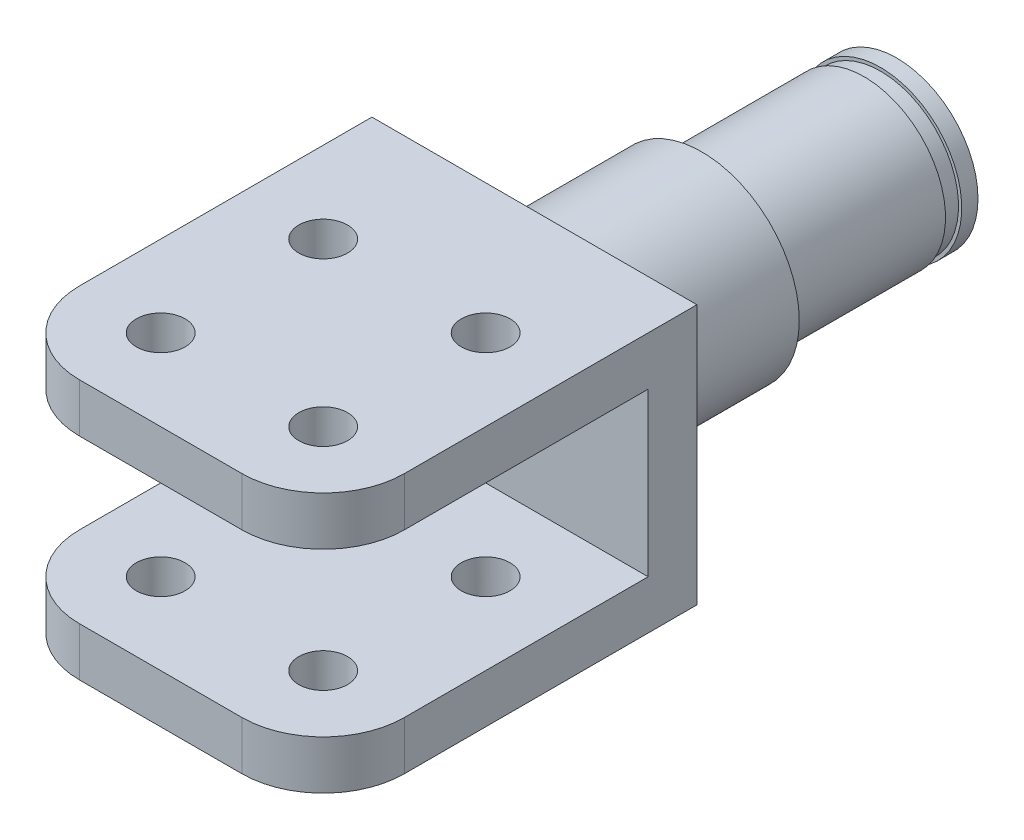
ISO-10303-21;
HEADER;
FILE_DESCRIPTION(('STEP AP214'),'2;1');
FILE_NAME('part.step','',(''),(''),'','','');
FILE_SCHEMA(('AUTOMOTIVE_DESIGN { 1 0 10303 214 1 1 1 1 }'));
ENDSEC;
DATA;
#1=APPLICATION_CONTEXT('core data for automotive mechanical design processes');
#2=APPLICATION_PROTOCOL_DEFINITION('international standard','automotive_design',2000,#1);
#3=PRODUCT_CONTEXT('',#1,'mechanical');
#4=PRODUCT('Part','Part','',(#3));
#5=PRODUCT_RELATED_PRODUCT_CATEGORY('part','',(#4));
#6=PRODUCT_DEFINITION_FORMATION('','',#4);
#7=PRODUCT_DEFINITION_CONTEXT('part definition',#1,'design');
#8=PRODUCT_DEFINITION('design','',#6,#7);
#9=PRODUCT_DEFINITION_SHAPE('','',#8);
#10=(LENGTH_UNIT() NAMED_UNIT(*) SI_UNIT(.MILLI.,.METRE.));
#11=(NAMED_UNIT(*) PLANE_ANGLE_UNIT() SI_UNIT($,.RADIAN.));
#12=(NAMED_UNIT(*) SI_UNIT($,.STERADIAN.) SOLID_ANGLE_UNIT());
#13=UNCERTAINTY_MEASURE_WITH_UNIT(LENGTH_MEASURE(1.E-05),#10,'distance_accuracy_value','');
#14=(GEOMETRIC_REPRESENTATION_CONTEXT(3) GLOBAL_UNCERTAINTY_ASSIGNED_CONTEXT((#13)) GLOBAL_UNIT_ASSIGNED_CONTEXT((#10,
#11,#12)) REPRESENTATION_CONTEXT('',''));
#15=CARTESIAN_POINT('',(0.,0.,0.));
#16=DIRECTION('',(0.,0.,1.));
#17=DIRECTION('',(1.,0.,0.));
#18=AXIS2_PLACEMENT_3D('',#15,#16,#17);
#19=CARTESIAN_POINT('',(0.,0.,45.3));
#20=DIRECTION('',(0.,0.,1.));
#21=DIRECTION('',(1.,0.,0.));
#22=AXIS2_PLACEMENT_3D('',#19,#20,#21);
#23=PLANE('',#22);
#24=DIRECTION('',(1.,0.,0.));
#25=VECTOR('',#24,1.);
#26=CARTESIAN_POINT('',(-10.,-5.,45.3));
#27=LINE('',#26,#25);
#28=CARTESIAN_POINT('',(-5.,-5.,45.3));
#29=VERTEX_POINT('',#28);
#30=CARTESIAN_POINT('',(5.,-5.,45.3));
#31=VERTEX_POINT('',#30);
#32=EDGE_CURVE('E144',#29,#31,#27,.T.);
#33=ORIENTED_EDGE('',*,*,#32,.F.);
#34=DIRECTION('',(0.,-1.,0.));
#35=VECTOR('',#34,1.);
#36=CARTESIAN_POINT('',(-5.,-8.,45.3));
#37=LINE('',#36,#35);
#38=CARTESIAN_POINT('',(-5.,-8.,45.3));
#39=VERTEX_POINT('',#38);
#40=EDGE_CURVE('E247',#29,#39,#37,.T.);
#41=ORIENTED_EDGE('',*,*,#40,.T.);
#42=DIRECTION('',(1.,0.,0.));
#43=VECTOR('',#42,1.);
#44=CARTESIAN_POINT('',(-10.,-8.,45.3));
#45=LINE('',#44,#43);
#46=CARTESIAN_POINT('',(5.,-8.,45.3));
#47=VERTEX_POINT('',#46);
#48=EDGE_CURVE('E158',#39,#47,#45,.T.);
#49=ORIENTED_EDGE('',*,*,#48,.T.);
#50=DIRECTION('',(0.,1.,0.));
#51=VECTOR('',#50,1.);
#52=CARTESIAN_POINT('',(5.,-5.,45.3));
#53=LINE('',#52,#51);
#54=EDGE_CURVE('E244',#47,#31,#53,.T.);
#55=ORIENTED_EDGE('',*,*,#54,.T.);
#56=EDGE_LOOP('',(#33,#41,#49,#55));
#57=FACE_BOUND('',#56,.T.);
#58=ADVANCED_FACE('F37',(#57),#23,.T.);
#59=CARTESIAN_POINT('',(0.,0.,12.));
#60=DIRECTION('',(0.,0.,-1.));
#61=DIRECTION('',(-1.,0.,0.));
#62=AXIS2_PLACEMENT_3D('',#59,#60,#61);
#63=CYLINDRICAL_SURFACE('',#62,5.);
#64=CARTESIAN_POINT('',(0.,0.,12.));
#65=DIRECTION('',(0.,0.,1.));
#66=DIRECTION('',(1.,0.,0.));
#67=AXIS2_PLACEMENT_3D('',#64,#65,#66);
#68=CIRCLE('',#67,5.);
#69=CARTESIAN_POINT('',(5.,0.,12.));
#70=VERTEX_POINT('',#69);
#71=EDGE_CURVE('E201',#70,#70,#68,.T.);
#72=ORIENTED_EDGE('',*,*,#71,.F.);
#73=EDGE_LOOP('',(#72));
#74=FACE_BOUND('',#73,.T.);
#75=CARTESIAN_POINT('',(0.,0.,2.));
#76=DIRECTION('',(0.,0.,-1.));
#77=DIRECTION('',(-1.,0.,0.));
#78=AXIS2_PLACEMENT_3D('',#75,#76,#77);
#79=CIRCLE('',#78,5.);
#80=CARTESIAN_POINT('',(-5.,0.,2.));
#81=VERTEX_POINT('',#80);
#82=EDGE_CURVE('E195',#81,#81,#79,.T.);
#83=ORIENTED_EDGE('',*,*,#82,.F.);
#84=EDGE_LOOP('',(#83));
#85=FACE_BOUND('',#84,.T.);
#86=ADVANCED_FACE('F296',(#74,#85),#63,.T.);
#87=CARTESIAN_POINT('',(0.,0.,2.));
#88=DIRECTION('',(0.,0.,-1.));
#89=DIRECTION('',(-1.,0.,0.));
#90=AXIS2_PLACEMENT_3D('',#87,#88,#89);
#91=PLANE('',#90);
#92=CARTESIAN_POINT('',(0.,0.,2.));
#93=DIRECTION('',(0.,0.,-1.));
#94=DIRECTION('',(-1.,0.,0.));
#95=AXIS2_PLACEMENT_3D('',#92,#93,#94);
#96=CIRCLE('',#95,4.8);
#97=CARTESIAN_POINT('',(-4.8,0.,2.));
#98=VERTEX_POINT('',#97);
#99=EDGE_CURVE('E189',#98,#98,#96,.T.);
#100=ORIENTED_EDGE('',*,*,#99,.F.);
#101=EDGE_LOOP('',(#100));
#102=FACE_BOUND('',#101,.T.);
#103=ORIENTED_EDGE('',*,*,#82,.T.);
#104=EDGE_LOOP('',(#103));
#105=FACE_BOUND('',#104,.T.);
#106=ADVANCED_FACE('F302',(#102,#105),#91,.T.);
#107=CARTESIAN_POINT('',(0.,0.,1.));
#108=DIRECTION('',(0.,0.,-1.));
#109=DIRECTION('',(-1.,0.,0.));
#110=AXIS2_PLACEMENT_3D('',#107,#108,#109);
#111=PLANE('',#110);
#112=CARTESIAN_POINT('',(0.,0.,1.));
#113=DIRECTION('',(0.,0.,-1.));
#114=DIRECTION('',(-1.,0.,0.));
#115=AXIS2_PLACEMENT_3D('',#112,#113,#114);
#116=CIRCLE('',#115,4.8);
#117=CARTESIAN_POINT('',(-4.8,0.,1.));
#118=VERTEX_POINT('',#117);
#119=EDGE_CURVE('E186',#118,#118,#116,.T.);
#120=ORIENTED_EDGE('',*,*,#119,.T.);
#121=EDGE_LOOP('',(#120));
#122=FACE_BOUND('',#121,.T.);
#123=CARTESIAN_POINT('',(0.,0.,1.));
#124=DIRECTION('',(0.,0.,-1.));
#125=DIRECTION('',(-1.,0.,0.));
#126=AXIS2_PLACEMENT_3D('',#123,#124,#125);
#127=CIRCLE('',#126,5.);
#128=CARTESIAN_POINT('',(-5.,0.,1.));
#129=VERTEX_POINT('',#128);
#130=EDGE_CURVE('E192',#129,#129,#127,.T.);
#131=ORIENTED_EDGE('',*,*,#130,.F.);
#132=EDGE_LOOP('',(#131));
#133=FACE_BOUND('',#132,.T.);
#134=ADVANCED_FACE('F597',(#122,#133),#111,.F.);
#135=CARTESIAN_POINT('',(0.,0.,2.));
#136=DIRECTION('',(0.,0.,-1.));
#137=DIRECTION('',(-1.,0.,0.));
#138=AXIS2_PLACEMENT_3D('',#135,#136,#137);
#139=CYLINDRICAL_SURFACE('',#138,4.8);
#140=ORIENTED_EDGE('',*,*,#99,.T.);
#141=EDGE_LOOP('',(#140));
#142=FACE_BOUND('',#141,.T.);
#143=ORIENTED_EDGE('',*,*,#119,.F.);
#144=EDGE_LOOP('',(#143));
#145=FACE_BOUND('',#144,.T.);
#146=ADVANCED_FACE('F446',(#142,#145),#139,.T.);
#147=CARTESIAN_POINT('',(0.,0.,0.));
#148=DIRECTION('',(0.,0.,1.));
#149=DIRECTION('',(1.,0.,0.));
#150=AXIS2_PLACEMENT_3D('',#147,#148,#149);
#151=PLANE('',#150);
#152=CARTESIAN_POINT('',(0.,0.,0.));
#153=DIRECTION('',(0.,0.,-1.));
#154=DIRECTION('',(-1.,0.,0.));
#155=AXIS2_PLACEMENT_3D('',#152,#153,#154);
#156=CIRCLE('',#155,2.);
#157=CARTESIAN_POINT('',(-2.,0.,0.));
#158=VERTEX_POINT('',#157);
#159=EDGE_CURVE('E358',#158,#158,#156,.T.);
#160=ORIENTED_EDGE('',*,*,#159,.F.);
#161=EDGE_LOOP('',(#160));
#162=FACE_BOUND('',#161,.T.);
#163=CARTESIAN_POINT('',(0.,0.,0.));
#164=DIRECTION('',(0.,0.,1.));
#165=DIRECTION('',(1.,0.,0.));
#166=AXIS2_PLACEMENT_3D('',#163,#164,#165);
#167=CIRCLE('',#166,5.);
#168=CARTESIAN_POINT('',(5.,0.,0.));
#169=VERTEX_POINT('',#168);
#170=EDGE_CURVE('E198',#169,#169,#167,.T.);
#171=ORIENTED_EDGE('',*,*,#170,.F.);
#172=EDGE_LOOP('',(#171));
#173=FACE_BOUND('',#172,.T.);
#174=ADVANCED_FACE('F442',(#162,#173),#151,.F.);
#175=ORIENTED_EDGE('',*,*,#130,.T.);
#176=EDGE_LOOP('',(#175));
#177=FACE_BOUND('',#176,.T.);
#178=ORIENTED_EDGE('',*,*,#170,.T.);
#179=EDGE_LOOP('',(#178));
#180=FACE_BOUND('',#179,.T.);
#181=ADVANCED_FACE('F305',(#177,#180),#63,.T.);
#182=CARTESIAN_POINT('',(0.,0.,22.3));
#183=DIRECTION('',(0.,0.,-1.));
#184=DIRECTION('',(-1.,0.,0.));
#185=AXIS2_PLACEMENT_3D('',#182,#183,#184);
#186=CYLINDRICAL_SURFACE('',#185,6.);
#187=CARTESIAN_POINT('',(0.,0.,22.3));
#188=DIRECTION('',(0.,0.,1.));
#189=DIRECTION('',(1.,0.,0.));
#190=AXIS2_PLACEMENT_3D('',#187,#188,#189);
#191=CIRCLE('',#190,6.);
#192=CARTESIAN_POINT('',(-6.,0.,22.3));
#193=VERTEX_POINT('',#192);
#194=EDGE_CURVE('E183',#193,#193,#191,.T.);
#195=CARTESIAN_POINT('',(0.,0.,12.));
#196=DIRECTION('',(0.,0.,1.));
#197=DIRECTION('',(1.,0.,0.));
#198=AXIS2_PLACEMENT_3D('',#195,#196,#197);
#199=CIRCLE('',#198,6.);
#200=CARTESIAN_POINT('',(-6.,0.,12.));
#201=VERTEX_POINT('',#200);
#202=EDGE_CURVE('E182',#201,#201,#199,.T.);
#203=CARTESIAN_POINT('',(-6.,0.,22.3));
#204=CARTESIAN_POINT('',(-6.,0.,22.1927083333333));
#205=CARTESIAN_POINT('',(-6.,0.,22.0854166666667));
#206=CARTESIAN_POINT('',(-6.,0.,21.8708333333333));
#207=CARTESIAN_POINT('',(-6.,0.,21.7635416666667));
#208=CARTESIAN_POINT('',(-6.,0.,21.5489583333333));
#209=CARTESIAN_POINT('',(-6.,0.,21.4416666666667));
#210=CARTESIAN_POINT('',(-6.,0.,21.2270833333333));
#211=CARTESIAN_POINT('',(-6.,0.,21.1197916666667));
#212=CARTESIAN_POINT('',(-6.,0.,20.9052083333333));
#213=CARTESIAN_POINT('',(-6.,0.,20.7979166666667));
#214=CARTESIAN_POINT('',(-6.,0.,20.5833333333333));
#215=CARTESIAN_POINT('',(-6.,0.,20.4760416666667));
#216=CARTESIAN_POINT('',(-6.,0.,20.2614583333333));
#217=CARTESIAN_POINT('',(-6.,0.,20.1541666666667));
#218=CARTESIAN_POINT('',(-6.,0.,19.9395833333333));
#219=CARTESIAN_POINT('',(-6.,0.,19.8322916666667));
#220=CARTESIAN_POINT('',(-6.,0.,19.6177083333333));
#221=CARTESIAN_POINT('',(-6.,0.,19.5104166666667));
#222=CARTESIAN_POINT('',(-6.,0.,19.2958333333333));
#223=CARTESIAN_POINT('',(-6.,0.,19.1885416666667));
#224=CARTESIAN_POINT('',(-6.,0.,18.9739583333333));
#225=CARTESIAN_POINT('',(-6.,0.,18.8666666666667));
#226=CARTESIAN_POINT('',(-6.,0.,18.6520833333333));
#227=CARTESIAN_POINT('',(-6.,0.,18.5447916666667));
#228=CARTESIAN_POINT('',(-6.,0.,18.3302083333333));
#229=CARTESIAN_POINT('',(-6.,0.,18.2229166666667));
#230=CARTESIAN_POINT('',(-6.,0.,18.0083333333333));
#231=CARTESIAN_POINT('',(-6.,0.,17.9010416666667));
#232=CARTESIAN_POINT('',(-6.,0.,17.6864583333333));
#233=CARTESIAN_POINT('',(-6.,0.,17.5791666666667));
#234=CARTESIAN_POINT('',(-6.,0.,17.3645833333333));
#235=CARTESIAN_POINT('',(-6.,0.,17.2572916666667));
#236=CARTESIAN_POINT('',(-6.,0.,17.0427083333333));
#237=CARTESIAN_POINT('',(-6.,0.,16.9354166666667));
#238=CARTESIAN_POINT('',(-6.,0.,16.7208333333333));
#239=CARTESIAN_POINT('',(-6.,0.,16.6135416666667));
#240=CARTESIAN_POINT('',(-6.,0.,16.3989583333333));
#241=CARTESIAN_POINT('',(-6.,0.,16.2916666666667));
#242=CARTESIAN_POINT('',(-6.,0.,16.0770833333333));
#243=CARTESIAN_POINT('',(-6.,0.,15.9697916666667));
#244=CARTESIAN_POINT('',(-6.,0.,15.7552083333333));
#245=CARTESIAN_POINT('',(-6.,0.,15.6479166666667));
#246=CARTESIAN_POINT('',(-6.,0.,15.4333333333333));
#247=CARTESIAN_POINT('',(-6.,0.,15.3260416666667));
#248=CARTESIAN_POINT('',(-6.,0.,15.1114583333333));
#249=CARTESIAN_POINT('',(-6.,0.,15.0041666666667));
#250=CARTESIAN_POINT('',(-6.,0.,14.7895833333333));
#251=CARTESIAN_POINT('',(-6.,0.,14.6822916666667));
#252=CARTESIAN_POINT('',(-6.,0.,14.4677083333333));
#253=CARTESIAN_POINT('',(-6.,0.,14.3604166666667));
#254=CARTESIAN_POINT('',(-6.,0.,14.1458333333333));
#255=CARTESIAN_POINT('',(-6.,0.,14.0385416666667));
#256=CARTESIAN_POINT('',(-6.,0.,13.8239583333333));
#257=CARTESIAN_POINT('',(-6.,0.,13.7166666666667));
#258=CARTESIAN_POINT('',(-6.,0.,13.5020833333333));
#259=CARTESIAN_POINT('',(-6.,0.,13.3947916666667));
#260=CARTESIAN_POINT('',(-6.,0.,13.1802083333333));
#261=CARTESIAN_POINT('',(-6.,0.,13.0729166666667));
#262=CARTESIAN_POINT('',(-6.,0.,12.8583333333333));
#263=CARTESIAN_POINT('',(-6.,0.,12.7510416666667));
#264=CARTESIAN_POINT('',(-6.,0.,12.5364583333333));
#265=CARTESIAN_POINT('',(-6.,0.,12.4291666666667));
#266=CARTESIAN_POINT('',(-6.,0.,12.2145833333333));
#267=CARTESIAN_POINT('',(-6.,0.,12.1072916666667));
#268=CARTESIAN_POINT('',(-6.,0.,12.));
#269=B_SPLINE_CURVE_WITH_KNOTS('',3,(#203,#204,#205,#206,#207,#208,#209,#210,#211,#212,#213,
#214,#215,#216,#217,#218,#219,#220,#221,#222,#223,#224,#225,#226,#227,#228,#229,#230,#231,#232,
#233,#234,#235,#236,#237,#238,#239,#240,#241,#242,#243,#244,#245,#246,#247,#248,#249,#250,#251,
#252,#253,#254,#255,#256,#257,#258,#259,#260,#261,#262,#263,#264,#265,#266,#267,#268),
.UNSPECIFIED.,.F.,.F.,(4,2,2,2,2,2,2,2,2,2,2,2,2,2,2,2,2,2,2,2,2,2,2,2,2,2,2,2,2,2,2,2,4),(0.,
0.321875000000003,0.643750000000002,0.965625000000001,1.2875,1.609375,1.93125,2.253125,2.575,
2.896875,3.21875,3.540625,3.8625,4.184375,4.50625,4.828125,5.15,5.471875,5.79375,6.115625,
6.4375,6.759375,7.08125,7.403125,7.725,8.046875,8.36875,8.690625,9.0125,9.334375,9.65625,
9.978125,10.3),.UNSPECIFIED.);
#270=EDGE_CURVE('BSEAM573',#193,#201,#269,.T.);
#271=ORIENTED_EDGE('',*,*,#194,.F.);
#272=ORIENTED_EDGE('',*,*,#202,.T.);
#273=ORIENTED_EDGE('',*,*,#270,.T.);
#274=ORIENTED_EDGE('',*,*,#270,.F.);
#275=EDGE_LOOP('',(#271,#273,#272,#274));
#276=FACE_BOUND('',#275,.T.);
#277=ADVANCED_FACE('F573',(#276),#186,.T.);
#278=CARTESIAN_POINT('',(0.,0.,12.));
#279=DIRECTION('',(0.,0.,1.));
#280=DIRECTION('',(1.,0.,0.));
#281=AXIS2_PLACEMENT_3D('',#278,#279,#280);
#282=PLANE('',#281);
#283=ORIENTED_EDGE('',*,*,#71,.T.);
#284=EDGE_LOOP('',(#283));
#285=FACE_BOUND('',#284,.T.);
#286=ORIENTED_EDGE('',*,*,#202,.F.);
#287=EDGE_LOOP('',(#286));
#288=FACE_BOUND('',#287,.T.);
#289=ADVANCED_FACE('F556',(#285,#288),#282,.F.);
#290=CARTESIAN_POINT('',(10.,8.,45.3));
#291=DIRECTION('',(-1.,0.,0.));
#292=DIRECTION('',(0.,-1.,0.));
#293=AXIS2_PLACEMENT_3D('',#290,#291,#292);
#294=PLANE('',#293);
#295=DIRECTION('',(0.,0.,1.));
#296=VECTOR('',#295,1.);
#297=CARTESIAN_POINT('',(9.99999999999999,-5.,25.3));
#298=LINE('',#297,#296);
#299=CARTESIAN_POINT('',(9.99999999999999,-5.,25.3));
#300=VERTEX_POINT('',#299);
#301=CARTESIAN_POINT('',(9.99999999999999,-5.,40.3));
#302=VERTEX_POINT('',#301);
#303=EDGE_CURVE('E167',#300,#302,#298,.T.);
#304=ORIENTED_EDGE('',*,*,#303,.T.);
#305=DIRECTION('',(0.,1.,0.));
#306=VECTOR('',#305,1.);
#307=CARTESIAN_POINT('',(10.,-8.,40.3));
#308=LINE('',#307,#306);
#309=CARTESIAN_POINT('',(10.,-8.,40.3));
#310=VERTEX_POINT('',#309);
#311=EDGE_CURVE('E11',#302,#310,#308,.F.);
#312=ORIENTED_EDGE('',*,*,#311,.T.);
#313=DIRECTION('',(0.,0.,-1.));
#314=VECTOR('',#313,1.);
#315=CARTESIAN_POINT('',(10.,-8.,45.3));
#316=LINE('',#315,#314);
#317=CARTESIAN_POINT('',(10.,-8.,22.3));
#318=VERTEX_POINT('',#317);
#319=EDGE_CURVE('E162',#310,#318,#316,.T.);
#320=ORIENTED_EDGE('',*,*,#319,.T.);
#321=DIRECTION('',(0.,1.,0.));
#322=VECTOR('',#321,1.);
#323=CARTESIAN_POINT('',(10.,8.,22.3));
#324=LINE('',#323,#322);
#325=CARTESIAN_POINT('',(10.,8.,22.3));
#326=VERTEX_POINT('',#325);
#327=EDGE_CURVE('E163',#318,#326,#324,.T.);
#328=ORIENTED_EDGE('',*,*,#327,.T.);
#329=DIRECTION('',(0.,0.,-1.));
#330=VECTOR('',#329,1.);
#331=CARTESIAN_POINT('',(10.,8.,45.3));
#332=LINE('',#331,#330);
#333=CARTESIAN_POINT('',(10.,8.,40.3));
#334=VERTEX_POINT('',#333);
#335=EDGE_CURVE('E180',#334,#326,#332,.T.);
#336=ORIENTED_EDGE('',*,*,#335,.F.);
#337=DIRECTION('',(0.,1.,0.));
#338=VECTOR('',#337,1.);
#339=CARTESIAN_POINT('',(10.,5.,40.3));
#340=LINE('',#339,#338);
#341=CARTESIAN_POINT('',(9.99999999999999,5.,40.3));
#342=VERTEX_POINT('',#341);
#343=EDGE_CURVE('E46',#334,#342,#340,.F.);
#344=ORIENTED_EDGE('',*,*,#343,.T.);
#345=DIRECTION('',(0.,0.,1.));
#346=VECTOR('',#345,1.);
#347=CARTESIAN_POINT('',(9.99999999999999,5.,25.3));
#348=LINE('',#347,#346);
#349=CARTESIAN_POINT('',(9.99999999999999,5.,25.3));
#350=VERTEX_POINT('',#349);
#351=EDGE_CURVE('E130',#350,#342,#348,.T.);
#352=ORIENTED_EDGE('',*,*,#351,.F.);
#353=DIRECTION('',(0.,1.,0.));
#354=VECTOR('',#353,1.);
#355=CARTESIAN_POINT('',(9.99999999999999,5.,25.3));
#356=LINE('',#355,#354);
#357=EDGE_CURVE('E137',#300,#350,#356,.T.);
#358=ORIENTED_EDGE('',*,*,#357,.F.);
#359=EDGE_LOOP('',(#304,#312,#320,#328,#336,#344,#352,#358));
#360=FACE_BOUND('',#359,.T.);
#361=ADVANCED_FACE('F146',(#360),#294,.F.);
#362=CARTESIAN_POINT('',(-10.,8.,45.3));
#363=DIRECTION('',(0.,-1.,0.));
#364=DIRECTION('',(0.,0.,-1.));
#365=AXIS2_PLACEMENT_3D('',#362,#363,#364);
#366=PLANE('',#365);
#367=CARTESIAN_POINT('',(5.,8.,30.3));
#368=DIRECTION('',(0.,1.,0.));
#369=DIRECTION('',(0.,0.,1.));
#370=AXIS2_PLACEMENT_3D('',#367,#368,#369);
#371=CIRCLE('',#370,1.5);
#372=CARTESIAN_POINT('',(5.,8.,31.8));
#373=VERTEX_POINT('',#372);
#374=EDGE_CURVE('E350',#373,#373,#371,.T.);
#375=ORIENTED_EDGE('',*,*,#374,.F.);
#376=EDGE_LOOP('',(#375));
#377=FACE_BOUND('',#376,.T.);
#378=CARTESIAN_POINT('',(-5.,8.,30.3));
#379=DIRECTION('',(0.,1.,0.));
#380=DIRECTION('',(0.,0.,1.));
#381=AXIS2_PLACEMENT_3D('',#378,#379,#380);
#382=CIRCLE('',#381,1.5);
#383=CARTESIAN_POINT('',(-5.,8.,31.8));
#384=VERTEX_POINT('',#383);
#385=EDGE_CURVE('E353',#384,#384,#382,.T.);
#386=ORIENTED_EDGE('',*,*,#385,.F.);
#387=EDGE_LOOP('',(#386));
#388=FACE_BOUND('',#387,.T.);
#389=CARTESIAN_POINT('',(-5.,8.,40.3));
#390=DIRECTION('',(0.,1.,0.));
#391=DIRECTION('',(0.,0.,1.));
#392=AXIS2_PLACEMENT_3D('',#389,#390,#391);
#393=CIRCLE('',#392,1.5);
#394=CARTESIAN_POINT('',(-5.,8.,41.8));
#395=VERTEX_POINT('',#394);
#396=EDGE_CURVE('E349',#395,#395,#393,.T.);
#397=ORIENTED_EDGE('',*,*,#396,.F.);
#398=EDGE_LOOP('',(#397));
#399=FACE_BOUND('',#398,.T.);
#400=CARTESIAN_POINT('',(5.,8.,40.3));
#401=DIRECTION('',(0.,1.,0.));
#402=DIRECTION('',(0.,0.,1.));
#403=AXIS2_PLACEMENT_3D('',#400,#401,#402);
#404=CIRCLE('',#403,1.5);
#405=CARTESIAN_POINT('',(5.,8.,41.8));
#406=VERTEX_POINT('',#405);
#407=EDGE_CURVE('E211',#406,#406,#404,.T.);
#408=ORIENTED_EDGE('',*,*,#407,.F.);
#409=EDGE_LOOP('',(#408));
#410=FACE_BOUND('',#409,.T.);
#411=DIRECTION('',(0.,0.,-1.));
#412=VECTOR('',#411,1.);
#413=CARTESIAN_POINT('',(-10.,8.,45.3));
#414=LINE('',#413,#412);
#415=CARTESIAN_POINT('',(-10.,8.,40.3));
#416=VERTEX_POINT('',#415);
#417=CARTESIAN_POINT('',(-10.,8.,22.3));
#418=VERTEX_POINT('',#417);
#419=EDGE_CURVE('E178',#416,#418,#414,.T.);
#420=ORIENTED_EDGE('',*,*,#419,.F.);
#421=CARTESIAN_POINT('',(-5.,8.,40.3));
#422=DIRECTION('',(0.,-1.,0.));
#423=DIRECTION('',(0.,0.,-1.));
#424=AXIS2_PLACEMENT_3D('',#421,#422,#423);
#425=CIRCLE('',#424,5.);
#426=CARTESIAN_POINT('',(-5.,8.,45.3));
#427=VERTEX_POINT('',#426);
#428=EDGE_CURVE('E242',#416,#427,#425,.F.);
#429=ORIENTED_EDGE('',*,*,#428,.T.);
#430=DIRECTION('',(-1.,0.,0.));
#431=VECTOR('',#430,1.);
#432=CARTESIAN_POINT('',(-10.,8.,45.3));
#433=LINE('',#432,#431);
#434=CARTESIAN_POINT('',(5.,8.,45.3));
#435=VERTEX_POINT('',#434);
#436=EDGE_CURVE('E155',#435,#427,#433,.T.);
#437=ORIENTED_EDGE('',*,*,#436,.F.);
#438=CARTESIAN_POINT('',(5.,8.,40.3));
#439=DIRECTION('',(0.,-1.,0.));
#440=DIRECTION('',(0.,0.,-1.));
#441=AXIS2_PLACEMENT_3D('',#438,#439,#440);
#442=CIRCLE('',#441,5.);
#443=EDGE_CURVE('E240',#435,#334,#442,.F.);
#444=ORIENTED_EDGE('',*,*,#443,.T.);
#445=ORIENTED_EDGE('',*,*,#335,.T.);
#446=DIRECTION('',(-1.,0.,0.));
#447=VECTOR('',#446,1.);
#448=CARTESIAN_POINT('',(-10.,8.,22.3));
#449=LINE('',#448,#447);
#450=EDGE_CURVE('E166',#326,#418,#449,.T.);
#451=ORIENTED_EDGE('',*,*,#450,.T.);
#452=EDGE_LOOP('',(#420,#429,#437,#444,#445,#451));
#453=FACE_BOUND('',#452,.T.);
#454=ADVANCED_FACE('F539',(#377,#388,#399,#410,#453),#366,.F.);
#455=CARTESIAN_POINT('',(-10.,8.,45.3));
#456=DIRECTION('',(1.,0.,0.));
#457=DIRECTION('',(0.,0.,-1.));
#458=AXIS2_PLACEMENT_3D('',#455,#456,#457);
#459=PLANE('',#458);
#460=DIRECTION('',(0.,0.,1.));
#461=VECTOR('',#460,1.);
#462=CARTESIAN_POINT('',(-10.,5.,25.3));
#463=LINE('',#462,#461);
#464=CARTESIAN_POINT('',(-10.,5.,25.3));
#465=VERTEX_POINT('',#464);
#466=CARTESIAN_POINT('',(-10.,5.,40.3));
#467=VERTEX_POINT('',#466);
#468=EDGE_CURVE('E133',#465,#467,#463,.T.);
#469=ORIENTED_EDGE('',*,*,#468,.T.);
#470=DIRECTION('',(0.,-1.,0.));
#471=VECTOR('',#470,1.);
#472=CARTESIAN_POINT('',(-10.,8.,40.3));
#473=LINE('',#472,#471);
#474=EDGE_CURVE('E238',#467,#416,#473,.F.);
#475=ORIENTED_EDGE('',*,*,#474,.T.);
#476=ORIENTED_EDGE('',*,*,#419,.T.);
#477=DIRECTION('',(0.,-1.,0.));
#478=VECTOR('',#477,1.);
#479=CARTESIAN_POINT('',(-10.,8.,22.3));
#480=LINE('',#479,#478);
#481=CARTESIAN_POINT('',(-10.,-8.,22.3));
#482=VERTEX_POINT('',#481);
#483=EDGE_CURVE('E170',#418,#482,#480,.T.);
#484=ORIENTED_EDGE('',*,*,#483,.T.);
#485=DIRECTION('',(0.,0.,-1.));
#486=VECTOR('',#485,1.);
#487=CARTESIAN_POINT('',(-10.,-8.,45.3));
#488=LINE('',#487,#486);
#489=CARTESIAN_POINT('',(-10.,-8.,40.3));
#490=VERTEX_POINT('',#489);
#491=EDGE_CURVE('E176',#490,#482,#488,.T.);
#492=ORIENTED_EDGE('',*,*,#491,.F.);
#493=DIRECTION('',(0.,-1.,0.));
#494=VECTOR('',#493,1.);
#495=CARTESIAN_POINT('',(-10.,-5.,40.3));
#496=LINE('',#495,#494);
#497=CARTESIAN_POINT('',(-10.,-5.,40.3));
#498=VERTEX_POINT('',#497);
#499=EDGE_CURVE('E236',#490,#498,#496,.F.);
#500=ORIENTED_EDGE('',*,*,#499,.T.);
#501=DIRECTION('',(0.,0.,1.));
#502=VECTOR('',#501,1.);
#503=CARTESIAN_POINT('',(-10.,-5.,25.3));
#504=LINE('',#503,#502);
#505=CARTESIAN_POINT('',(-10.,-5.,25.3));
#506=VERTEX_POINT('',#505);
#507=EDGE_CURVE('E150',#506,#498,#504,.T.);
#508=ORIENTED_EDGE('',*,*,#507,.F.);
#509=DIRECTION('',(0.,-1.,0.));
#510=VECTOR('',#509,1.);
#511=CARTESIAN_POINT('',(-10.,5.,25.3));
#512=LINE('',#511,#510);
#513=EDGE_CURVE('E136',#465,#506,#512,.T.);
#514=ORIENTED_EDGE('',*,*,#513,.F.);
#515=EDGE_LOOP('',(#469,#475,#476,#484,#492,#500,#508,#514));
#516=FACE_BOUND('',#515,.T.);
#517=ADVANCED_FACE('F275',(#516),#459,.F.);
#518=CARTESIAN_POINT('',(-10.,-8.,45.3));
#519=DIRECTION('',(0.,1.,0.));
#520=DIRECTION('',(0.,0.,1.));
#521=AXIS2_PLACEMENT_3D('',#518,#519,#520);
#522=PLANE('',#521);
#523=CARTESIAN_POINT('',(5.,-8.,30.3));
#524=DIRECTION('',(0.,1.,0.));
#525=DIRECTION('',(0.,0.,1.));
#526=AXIS2_PLACEMENT_3D('',#523,#524,#525);
#527=CIRCLE('',#526,1.5);
#528=CARTESIAN_POINT('',(5.,-8.,31.8));
#529=VERTEX_POINT('',#528);
#530=EDGE_CURVE('E327',#529,#529,#527,.T.);
#531=ORIENTED_EDGE('',*,*,#530,.T.);
#532=EDGE_LOOP('',(#531));
#533=FACE_BOUND('',#532,.T.);
#534=CARTESIAN_POINT('',(-5.,-8.,30.3));
#535=DIRECTION('',(0.,1.,0.));
#536=DIRECTION('',(0.,0.,1.));
#537=AXIS2_PLACEMENT_3D('',#534,#535,#536);
#538=CIRCLE('',#537,1.5);
#539=CARTESIAN_POINT('',(-5.,-8.,31.8));
#540=VERTEX_POINT('',#539);
#541=EDGE_CURVE('E226',#540,#540,#538,.T.);
#542=ORIENTED_EDGE('',*,*,#541,.T.);
#543=EDGE_LOOP('',(#542));
#544=FACE_BOUND('',#543,.T.);
#545=CARTESIAN_POINT('',(-5.,-8.,40.3));
#546=DIRECTION('',(0.,1.,0.));
#547=DIRECTION('',(0.,0.,1.));
#548=AXIS2_PLACEMENT_3D('',#545,#546,#547);
#549=CIRCLE('',#548,1.5);
#550=CARTESIAN_POINT('',(-5.,-8.,41.8));
#551=VERTEX_POINT('',#550);
#552=EDGE_CURVE('E221',#551,#551,#549,.T.);
#553=ORIENTED_EDGE('',*,*,#552,.T.);
#554=EDGE_LOOP('',(#553));
#555=FACE_BOUND('',#554,.T.);
#556=CARTESIAN_POINT('',(5.,-8.,40.3));
#557=DIRECTION('',(0.,1.,0.));
#558=DIRECTION('',(0.,0.,1.));
#559=AXIS2_PLACEMENT_3D('',#556,#557,#558);
#560=CIRCLE('',#559,1.5);
#561=CARTESIAN_POINT('',(5.,-8.,41.8));
#562=VERTEX_POINT('',#561);
#563=EDGE_CURVE('E216',#562,#562,#560,.T.);
#564=ORIENTED_EDGE('',*,*,#563,.T.);
#565=EDGE_LOOP('',(#564));
#566=FACE_BOUND('',#565,.T.);
#567=ORIENTED_EDGE('',*,*,#48,.F.);
#568=CARTESIAN_POINT('',(-5.,-8.,40.3));
#569=DIRECTION('',(0.,1.,0.));
#570=DIRECTION('',(0.,0.,1.));
#571=AXIS2_PLACEMENT_3D('',#568,#569,#570);
#572=CIRCLE('',#571,5.);
#573=EDGE_CURVE('E252',#39,#490,#572,.F.);
#574=ORIENTED_EDGE('',*,*,#573,.T.);
#575=ORIENTED_EDGE('',*,*,#491,.T.);
#576=DIRECTION('',(1.,0.,0.));
#577=VECTOR('',#576,1.);
#578=CARTESIAN_POINT('',(-10.,-8.,22.3));
#579=LINE('',#578,#577);
#580=EDGE_CURVE('E159',#482,#318,#579,.T.);
#581=ORIENTED_EDGE('',*,*,#580,.T.);
#582=ORIENTED_EDGE('',*,*,#319,.F.);
#583=CARTESIAN_POINT('',(5.,-8.,40.3));
#584=DIRECTION('',(0.,1.,0.));
#585=DIRECTION('',(0.,0.,1.));
#586=AXIS2_PLACEMENT_3D('',#583,#584,#585);
#587=CIRCLE('',#586,5.);
#588=EDGE_CURVE('E250',#310,#47,#587,.F.);
#589=ORIENTED_EDGE('',*,*,#588,.T.);
#590=EDGE_LOOP('',(#567,#574,#575,#581,#582,#589));
#591=FACE_BOUND('',#590,.T.);
#592=ADVANCED_FACE('F273',(#533,#544,#555,#566,#591),#522,.F.);
#593=ORIENTED_EDGE('',*,*,#436,.T.);
#594=DIRECTION('',(0.,-1.,0.));
#595=VECTOR('',#594,1.);
#596=CARTESIAN_POINT('',(-5.,5.,45.3));
#597=LINE('',#596,#595);
#598=CARTESIAN_POINT('',(-5.,5.,45.3));
#599=VERTEX_POINT('',#598);
#600=EDGE_CURVE('E229',#427,#599,#597,.T.);
#601=ORIENTED_EDGE('',*,*,#600,.T.);
#602=DIRECTION('',(-1.,0.,0.));
#603=VECTOR('',#602,1.);
#604=CARTESIAN_POINT('',(-10.,5.,45.3));
#605=LINE('',#604,#603);
#606=CARTESIAN_POINT('',(5.,5.,45.3));
#607=VERTEX_POINT('',#606);
#608=EDGE_CURVE('E268',#607,#599,#605,.T.);
#609=ORIENTED_EDGE('',*,*,#608,.F.);
#610=DIRECTION('',(0.,1.,0.));
#611=VECTOR('',#610,1.);
#612=CARTESIAN_POINT('',(5.,8.,45.3));
#613=LINE('',#612,#611);
#614=EDGE_CURVE('E204',#607,#435,#613,.T.);
#615=ORIENTED_EDGE('',*,*,#614,.T.);
#616=EDGE_LOOP('',(#593,#601,#609,#615));
#617=FACE_BOUND('',#616,.T.);
#618=ADVANCED_FACE('F298',(#617),#23,.T.);
#619=CARTESIAN_POINT('',(0.,0.,22.3));
#620=DIRECTION('',(0.,0.,1.));
#621=DIRECTION('',(1.,0.,0.));
#622=AXIS2_PLACEMENT_3D('',#619,#620,#621);
#623=PLANE('',#622);
#624=ORIENTED_EDGE('',*,*,#194,.T.);
#625=EDGE_LOOP('',(#624));
#626=FACE_BOUND('',#625,.T.);
#627=ORIENTED_EDGE('',*,*,#327,.F.);
#628=ORIENTED_EDGE('',*,*,#580,.F.);
#629=ORIENTED_EDGE('',*,*,#483,.F.);
#630=ORIENTED_EDGE('',*,*,#450,.F.);
#631=EDGE_LOOP('',(#627,#628,#629,#630));
#632=FACE_BOUND('',#631,.T.);
#633=ADVANCED_FACE('F282',(#626,#632),#623,.F.);
#634=CARTESIAN_POINT('',(-10.,-5.,25.3));
#635=DIRECTION('',(0.,-1.,0.));
#636=DIRECTION('',(0.,0.,-1.));
#637=AXIS2_PLACEMENT_3D('',#634,#635,#636);
#638=PLANE('',#637);
#639=CARTESIAN_POINT('',(5.,-5.,30.3));
#640=DIRECTION('',(0.,-1.,0.));
#641=DIRECTION('',(0.,0.,-1.));
#642=AXIS2_PLACEMENT_3D('',#639,#640,#641);
#643=CIRCLE('',#642,1.5);
#644=CARTESIAN_POINT('',(5.,-5.,28.8));
#645=VERTEX_POINT('',#644);
#646=EDGE_CURVE('E225',#645,#645,#643,.T.);
#647=ORIENTED_EDGE('',*,*,#646,.T.);
#648=EDGE_LOOP('',(#647));
#649=FACE_BOUND('',#648,.T.);
#650=CARTESIAN_POINT('',(-5.,-5.,30.3));
#651=DIRECTION('',(0.,-1.,0.));
#652=DIRECTION('',(0.,0.,-1.));
#653=AXIS2_PLACEMENT_3D('',#650,#651,#652);
#654=CIRCLE('',#653,1.5);
#655=CARTESIAN_POINT('',(-5.,-5.,28.8));
#656=VERTEX_POINT('',#655);
#657=EDGE_CURVE('E220',#656,#656,#654,.T.);
#658=ORIENTED_EDGE('',*,*,#657,.T.);
#659=EDGE_LOOP('',(#658));
#660=FACE_BOUND('',#659,.T.);
#661=CARTESIAN_POINT('',(-5.,-5.,40.3));
#662=DIRECTION('',(0.,-1.,0.));
#663=DIRECTION('',(0.,0.,-1.));
#664=AXIS2_PLACEMENT_3D('',#661,#662,#663);
#665=CIRCLE('',#664,1.5);
#666=CARTESIAN_POINT('',(-5.,-5.,38.8));
#667=VERTEX_POINT('',#666);
#668=EDGE_CURVE('E215',#667,#667,#665,.T.);
#669=ORIENTED_EDGE('',*,*,#668,.T.);
#670=EDGE_LOOP('',(#669));
#671=FACE_BOUND('',#670,.T.);
#672=CARTESIAN_POINT('',(5.,-5.,40.3));
#673=DIRECTION('',(0.,-1.,0.));
#674=DIRECTION('',(0.,0.,-1.));
#675=AXIS2_PLACEMENT_3D('',#672,#673,#674);
#676=CIRCLE('',#675,1.5);
#677=CARTESIAN_POINT('',(5.,-5.,38.8));
#678=VERTEX_POINT('',#677);
#679=EDGE_CURVE('E210',#678,#678,#676,.T.);
#680=ORIENTED_EDGE('',*,*,#679,.T.);
#681=EDGE_LOOP('',(#680));
#682=FACE_BOUND('',#681,.T.);
#683=ORIENTED_EDGE('',*,*,#507,.T.);
#684=CARTESIAN_POINT('',(-5.,-5.,40.3));
#685=DIRECTION('',(0.,-1.,0.));
#686=DIRECTION('',(0.,0.,-1.));
#687=AXIS2_PLACEMENT_3D('',#684,#685,#686);
#688=CIRCLE('',#687,5.);
#689=EDGE_CURVE('E255',#498,#29,#688,.F.);
#690=ORIENTED_EDGE('',*,*,#689,.T.);
#691=ORIENTED_EDGE('',*,*,#32,.T.);
#692=CARTESIAN_POINT('',(5.,-5.,40.3));
#693=DIRECTION('',(0.,-1.,0.));
#694=DIRECTION('',(0.,0.,-1.));
#695=AXIS2_PLACEMENT_3D('',#692,#693,#694);
#696=CIRCLE('',#695,5.);
#697=EDGE_CURVE('E53',#31,#302,#696,.F.);
#698=ORIENTED_EDGE('',*,*,#697,.T.);
#699=ORIENTED_EDGE('',*,*,#303,.F.);
#700=DIRECTION('',(1.,0.,0.));
#701=VECTOR('',#700,1.);
#702=CARTESIAN_POINT('',(-10.,-5.,25.3));
#703=LINE('',#702,#701);
#704=EDGE_CURVE('E143',#506,#300,#703,.T.);
#705=ORIENTED_EDGE('',*,*,#704,.F.);
#706=EDGE_LOOP('',(#683,#690,#691,#698,#699,#705));
#707=FACE_BOUND('',#706,.T.);
#708=ADVANCED_FACE('F260',(#649,#660,#671,#682,#707),#638,.F.);
#709=CARTESIAN_POINT('',(-10.,5.,25.3));
#710=DIRECTION('',(0.,1.,0.));
#711=DIRECTION('',(0.,0.,1.));
#712=AXIS2_PLACEMENT_3D('',#709,#710,#711);
#713=PLANE('',#712);
#714=CARTESIAN_POINT('',(5.,5.,30.3));
#715=DIRECTION('',(0.,1.,0.));
#716=DIRECTION('',(0.,0.,1.));
#717=AXIS2_PLACEMENT_3D('',#714,#715,#716);
#718=CIRCLE('',#717,1.5);
#719=CARTESIAN_POINT('',(5.,5.,31.8));
#720=VERTEX_POINT('',#719);
#721=EDGE_CURVE('E222',#720,#720,#718,.T.);
#722=ORIENTED_EDGE('',*,*,#721,.T.);
#723=EDGE_LOOP('',(#722));
#724=FACE_BOUND('',#723,.T.);
#725=CARTESIAN_POINT('',(-5.,5.,30.3));
#726=DIRECTION('',(0.,1.,0.));
#727=DIRECTION('',(0.,0.,1.));
#728=AXIS2_PLACEMENT_3D('',#725,#726,#727);
#729=CIRCLE('',#728,1.5);
#730=CARTESIAN_POINT('',(-5.,5.,31.8));
#731=VERTEX_POINT('',#730);
#732=EDGE_CURVE('E217',#731,#731,#729,.T.);
#733=ORIENTED_EDGE('',*,*,#732,.T.);
#734=EDGE_LOOP('',(#733));
#735=FACE_BOUND('',#734,.T.);
#736=CARTESIAN_POINT('',(-5.,5.,40.3));
#737=DIRECTION('',(0.,1.,0.));
#738=DIRECTION('',(0.,0.,1.));
#739=AXIS2_PLACEMENT_3D('',#736,#737,#738);
#740=CIRCLE('',#739,1.5);
#741=CARTESIAN_POINT('',(-5.,5.,41.8));
#742=VERTEX_POINT('',#741);
#743=EDGE_CURVE('E212',#742,#742,#740,.T.);
#744=ORIENTED_EDGE('',*,*,#743,.T.);
#745=EDGE_LOOP('',(#744));
#746=FACE_BOUND('',#745,.T.);
#747=CARTESIAN_POINT('',(5.,5.,40.3));
#748=DIRECTION('',(0.,1.,0.));
#749=DIRECTION('',(0.,0.,1.));
#750=AXIS2_PLACEMENT_3D('',#747,#748,#749);
#751=CIRCLE('',#750,1.5);
#752=CARTESIAN_POINT('',(5.,5.,41.8));
#753=VERTEX_POINT('',#752);
#754=EDGE_CURVE('E207',#753,#753,#751,.T.);
#755=ORIENTED_EDGE('',*,*,#754,.T.);
#756=EDGE_LOOP('',(#755));
#757=FACE_BOUND('',#756,.T.);
#758=ORIENTED_EDGE('',*,*,#608,.T.);
#759=CARTESIAN_POINT('',(-5.,5.,40.3));
#760=DIRECTION('',(0.,1.,0.));
#761=DIRECTION('',(0.,0.,1.));
#762=AXIS2_PLACEMENT_3D('',#759,#760,#761);
#763=CIRCLE('',#762,5.);
#764=EDGE_CURVE('E234',#599,#467,#763,.F.);
#765=ORIENTED_EDGE('',*,*,#764,.T.);
#766=ORIENTED_EDGE('',*,*,#468,.F.);
#767=DIRECTION('',(-1.,0.,0.));
#768=VECTOR('',#767,1.);
#769=CARTESIAN_POINT('',(-10.,5.,25.3));
#770=LINE('',#769,#768);
#771=EDGE_CURVE('E125',#350,#465,#770,.T.);
#772=ORIENTED_EDGE('',*,*,#771,.F.);
#773=ORIENTED_EDGE('',*,*,#351,.T.);
#774=CARTESIAN_POINT('',(5.,5.,40.3));
#775=DIRECTION('',(0.,1.,0.));
#776=DIRECTION('',(0.,0.,1.));
#777=AXIS2_PLACEMENT_3D('',#774,#775,#776);
#778=CIRCLE('',#777,5.);
#779=EDGE_CURVE('E232',#342,#607,#778,.F.);
#780=ORIENTED_EDGE('',*,*,#779,.T.);
#781=EDGE_LOOP('',(#758,#765,#766,#772,#773,#780));
#782=FACE_BOUND('',#781,.T.);
#783=ADVANCED_FACE('F128',(#724,#735,#746,#757,#782),#713,.F.);
#784=CARTESIAN_POINT('',(0.,0.,25.3));
#785=DIRECTION('',(0.,0.,1.));
#786=DIRECTION('',(1.,0.,0.));
#787=AXIS2_PLACEMENT_3D('',#784,#785,#786);
#788=PLANE('',#787);
#789=CARTESIAN_POINT('',(0.,0.,25.3));
#790=DIRECTION('',(0.,0.,1.));
#791=DIRECTION('',(1.,0.,0.));
#792=AXIS2_PLACEMENT_3D('',#789,#790,#791);
#793=CIRCLE('',#792,2.);
#794=CARTESIAN_POINT('',(2.,0.,25.3));
#795=VERTEX_POINT('',#794);
#796=EDGE_CURVE('E41',#795,#795,#793,.T.);
#797=ORIENTED_EDGE('',*,*,#796,.F.);
#798=EDGE_LOOP('',(#797));
#799=FACE_BOUND('',#798,.T.);
#800=ORIENTED_EDGE('',*,*,#357,.T.);
#801=ORIENTED_EDGE('',*,*,#771,.T.);
#802=ORIENTED_EDGE('',*,*,#513,.T.);
#803=ORIENTED_EDGE('',*,*,#704,.T.);
#804=EDGE_LOOP('',(#800,#801,#802,#803));
#805=FACE_BOUND('',#804,.T.);
#806=ADVANCED_FACE('F141',(#799,#805),#788,.T.);
#807=CARTESIAN_POINT('',(5.,-12.,40.3));
#808=DIRECTION('',(0.,1.,0.));
#809=DIRECTION('',(0.,0.,1.));
#810=AXIS2_PLACEMENT_3D('',#807,#808,#809);
#811=CYLINDRICAL_SURFACE('',#810,1.5);
#812=ORIENTED_EDGE('',*,*,#407,.T.);
#813=EDGE_LOOP('',(#812));
#814=FACE_BOUND('',#813,.T.);
#815=ORIENTED_EDGE('',*,*,#754,.F.);
#816=EDGE_LOOP('',(#815));
#817=FACE_BOUND('',#816,.T.);
#818=ADVANCED_FACE('F367',(#814,#817),#811,.F.);
#819=CARTESIAN_POINT('',(-5.,-12.,40.3));
#820=DIRECTION('',(0.,1.,0.));
#821=DIRECTION('',(0.,0.,1.));
#822=AXIS2_PLACEMENT_3D('',#819,#820,#821);
#823=CYLINDRICAL_SURFACE('',#822,1.5);
#824=ORIENTED_EDGE('',*,*,#396,.T.);
#825=EDGE_LOOP('',(#824));
#826=FACE_BOUND('',#825,.T.);
#827=ORIENTED_EDGE('',*,*,#743,.F.);
#828=EDGE_LOOP('',(#827));
#829=FACE_BOUND('',#828,.T.);
#830=ADVANCED_FACE('F373',(#826,#829),#823,.F.);
#831=CARTESIAN_POINT('',(-5.,-12.,30.3));
#832=DIRECTION('',(0.,1.,0.));
#833=DIRECTION('',(0.,0.,1.));
#834=AXIS2_PLACEMENT_3D('',#831,#832,#833);
#835=CYLINDRICAL_SURFACE('',#834,1.5);
#836=ORIENTED_EDGE('',*,*,#385,.T.);
#837=EDGE_LOOP('',(#836));
#838=FACE_BOUND('',#837,.T.);
#839=ORIENTED_EDGE('',*,*,#732,.F.);
#840=EDGE_LOOP('',(#839));
#841=FACE_BOUND('',#840,.T.);
#842=ADVANCED_FACE('F405',(#838,#841),#835,.F.);
#843=CARTESIAN_POINT('',(5.,-12.,30.3));
#844=DIRECTION('',(0.,1.,0.));
#845=DIRECTION('',(0.,0.,1.));
#846=AXIS2_PLACEMENT_3D('',#843,#844,#845);
#847=CYLINDRICAL_SURFACE('',#846,1.5);
#848=ORIENTED_EDGE('',*,*,#374,.T.);
#849=EDGE_LOOP('',(#848));
#850=FACE_BOUND('',#849,.T.);
#851=ORIENTED_EDGE('',*,*,#721,.F.);
#852=EDGE_LOOP('',(#851));
#853=FACE_BOUND('',#852,.T.);
#854=ADVANCED_FACE('F395',(#850,#853),#847,.F.);
#855=ORIENTED_EDGE('',*,*,#679,.F.);
#856=EDGE_LOOP('',(#855));
#857=FACE_BOUND('',#856,.T.);
#858=ORIENTED_EDGE('',*,*,#563,.F.);
#859=EDGE_LOOP('',(#858));
#860=FACE_BOUND('',#859,.T.);
#861=ADVANCED_FACE('F376',(#857,#860),#811,.F.);
#862=ORIENTED_EDGE('',*,*,#668,.F.);
#863=EDGE_LOOP('',(#862));
#864=FACE_BOUND('',#863,.T.);
#865=ORIENTED_EDGE('',*,*,#552,.F.);
#866=EDGE_LOOP('',(#865));
#867=FACE_BOUND('',#866,.T.);
#868=ADVANCED_FACE('F394',(#864,#867),#823,.F.);
#869=ORIENTED_EDGE('',*,*,#657,.F.);
#870=EDGE_LOOP('',(#869));
#871=FACE_BOUND('',#870,.T.);
#872=ORIENTED_EDGE('',*,*,#541,.F.);
#873=EDGE_LOOP('',(#872));
#874=FACE_BOUND('',#873,.T.);
#875=ADVANCED_FACE('F402',(#871,#874),#835,.F.);
#876=ORIENTED_EDGE('',*,*,#646,.F.);
#877=EDGE_LOOP('',(#876));
#878=FACE_BOUND('',#877,.T.);
#879=ORIENTED_EDGE('',*,*,#530,.F.);
#880=EDGE_LOOP('',(#879));
#881=FACE_BOUND('',#880,.T.);
#882=ADVANCED_FACE('F407',(#878,#881),#847,.F.);
#883=CARTESIAN_POINT('',(-5.,0.,40.3));
#884=DIRECTION('',(0.,1.,0.));
#885=DIRECTION('',(0.,0.,1.));
#886=AXIS2_PLACEMENT_3D('',#883,#884,#885);
#887=CYLINDRICAL_SURFACE('',#886,5.);
#888=ORIENTED_EDGE('',*,*,#428,.F.);
#889=ORIENTED_EDGE('',*,*,#474,.F.);
#890=ORIENTED_EDGE('',*,*,#764,.F.);
#891=ORIENTED_EDGE('',*,*,#600,.F.);
#892=EDGE_LOOP('',(#888,#889,#890,#891));
#893=FACE_BOUND('',#892,.T.);
#894=ADVANCED_FACE('F293',(#893),#887,.T.);
#895=CARTESIAN_POINT('',(-5.,0.,40.3));
#896=DIRECTION('',(0.,1.,0.));
#897=DIRECTION('',(0.,0.,1.));
#898=AXIS2_PLACEMENT_3D('',#895,#896,#897);
#899=CYLINDRICAL_SURFACE('',#898,5.);
#900=ORIENTED_EDGE('',*,*,#689,.F.);
#901=ORIENTED_EDGE('',*,*,#499,.F.);
#902=ORIENTED_EDGE('',*,*,#573,.F.);
#903=ORIENTED_EDGE('',*,*,#40,.F.);
#904=EDGE_LOOP('',(#900,#901,#902,#903));
#905=FACE_BOUND('',#904,.T.);
#906=ADVANCED_FACE('F270',(#905),#899,.T.);
#907=CARTESIAN_POINT('',(5.,0.,40.3));
#908=DIRECTION('',(0.,-1.,0.));
#909=DIRECTION('',(1.,0.,0.));
#910=AXIS2_PLACEMENT_3D('',#907,#908,#909);
#911=CYLINDRICAL_SURFACE('',#910,5.);
#912=ORIENTED_EDGE('',*,*,#588,.F.);
#913=ORIENTED_EDGE('',*,*,#311,.F.);
#914=ORIENTED_EDGE('',*,*,#697,.F.);
#915=ORIENTED_EDGE('',*,*,#54,.F.);
#916=EDGE_LOOP('',(#912,#913,#914,#915));
#917=FACE_BOUND('',#916,.T.);
#918=ADVANCED_FACE('F285',(#917),#911,.T.);
#919=CARTESIAN_POINT('',(5.,0.,40.3));
#920=DIRECTION('',(0.,-1.,0.));
#921=DIRECTION('',(1.,0.,0.));
#922=AXIS2_PLACEMENT_3D('',#919,#920,#921);
#923=CYLINDRICAL_SURFACE('',#922,5.);
#924=ORIENTED_EDGE('',*,*,#779,.F.);
#925=ORIENTED_EDGE('',*,*,#343,.F.);
#926=ORIENTED_EDGE('',*,*,#443,.F.);
#927=ORIENTED_EDGE('',*,*,#614,.F.);
#928=EDGE_LOOP('',(#924,#925,#926,#927));
#929=FACE_BOUND('',#928,.T.);
#930=ADVANCED_FACE('F39',(#929),#923,.T.);
#931=CARTESIAN_POINT('',(0.,0.,45.3));
#932=DIRECTION('',(0.,0.,-1.));
#933=DIRECTION('',(-1.,0.,0.));
#934=AXIS2_PLACEMENT_3D('',#931,#932,#933);
#935=CYLINDRICAL_SURFACE('',#934,2.);
#936=ORIENTED_EDGE('',*,*,#796,.T.);
#937=EDGE_LOOP('',(#936));
#938=FACE_BOUND('',#937,.T.);
#939=ORIENTED_EDGE('',*,*,#159,.T.);
#940=EDGE_LOOP('',(#939));
#941=FACE_BOUND('',#940,.T.);
#942=ADVANCED_FACE('F291',(#938,#941),#935,.F.);
#943=CLOSED_SHELL('',(#58,#86,#106,#134,#146,#174,#181,#277,#289,#361,#454,#517,#592,#618,#633,
#708,#783,#806,#818,#830,#842,#854,#861,#868,#875,#882,#894,#906,#918,#930,#942));
#944=MANIFOLD_SOLID_BREP('B2',#943);
#945=ADVANCED_BREP_SHAPE_REPRESENTATION('',(#18,#944),#14);
#946=SHAPE_DEFINITION_REPRESENTATION(#9,#945);
ENDSEC;
END-ISO-10303-21;
